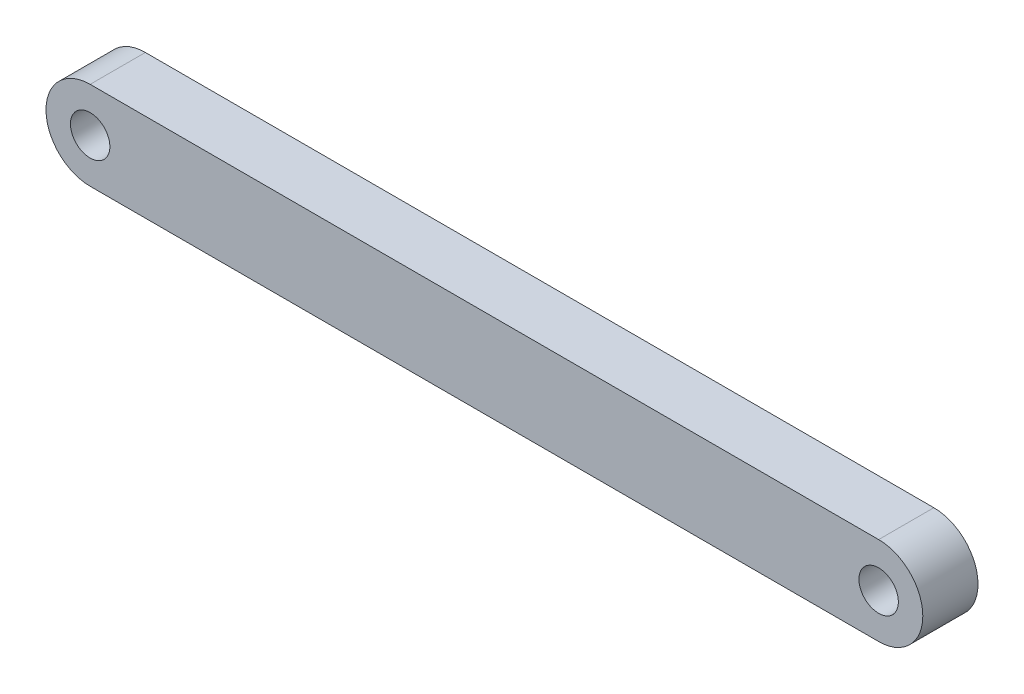
ISO-10303-21;
HEADER;
FILE_DESCRIPTION(('STEP AP214'),'2;1');
FILE_NAME('part.step','',(''),(''),'','','');
FILE_SCHEMA(('AUTOMOTIVE_DESIGN { 1 0 10303 214 1 1 1 1 }'));
ENDSEC;
DATA;
#1=APPLICATION_CONTEXT('core data for automotive mechanical design processes');
#2=APPLICATION_PROTOCOL_DEFINITION('international standard','automotive_design',2000,#1);
#3=PRODUCT_CONTEXT('',#1,'mechanical');
#4=PRODUCT('Part','Part','',(#3));
#5=PRODUCT_RELATED_PRODUCT_CATEGORY('part','',(#4));
#6=PRODUCT_DEFINITION_FORMATION('','',#4);
#7=PRODUCT_DEFINITION_CONTEXT('part definition',#1,'design');
#8=PRODUCT_DEFINITION('design','',#6,#7);
#9=PRODUCT_DEFINITION_SHAPE('','',#8);
#10=(LENGTH_UNIT() NAMED_UNIT(*) SI_UNIT(.MILLI.,.METRE.));
#11=(NAMED_UNIT(*) PLANE_ANGLE_UNIT() SI_UNIT($,.RADIAN.));
#12=(NAMED_UNIT(*) SI_UNIT($,.STERADIAN.) SOLID_ANGLE_UNIT());
#13=UNCERTAINTY_MEASURE_WITH_UNIT(LENGTH_MEASURE(1.E-05),#10,'distance_accuracy_value','');
#14=(GEOMETRIC_REPRESENTATION_CONTEXT(3) GLOBAL_UNCERTAINTY_ASSIGNED_CONTEXT((#13)) GLOBAL_UNIT_ASSIGNED_CONTEXT((#10,
#11,#12)) REPRESENTATION_CONTEXT('',''));
#15=CARTESIAN_POINT('',(0.,0.,0.));
#16=DIRECTION('',(0.,0.,1.));
#17=DIRECTION('',(1.,0.,0.));
#18=AXIS2_PLACEMENT_3D('',#15,#16,#17);
#19=CARTESIAN_POINT('',(454.527045833611,726.44,33.3375));
#20=DIRECTION('',(0.,0.,1.));
#21=DIRECTION('',(1.,0.,0.));
#22=AXIS2_PLACEMENT_3D('',#19,#20,#21);
#23=PLANE('',#22);
#24=CARTESIAN_POINT('',(454.527045833611,726.44,33.3375));
#25=DIRECTION('',(0.,0.,1.));
#26=DIRECTION('',(1.,0.,0.));
#27=AXIS2_PLACEMENT_3D('',#24,#25,#26);
#28=CIRCLE('',#27,7.9375);
#29=CARTESIAN_POINT('',(462.464545833611,726.44,33.3375));
#30=VERTEX_POINT('',#29);
#31=EDGE_CURVE('E100',#30,#30,#28,.T.);
#32=ORIENTED_EDGE('',*,*,#31,.F.);
#33=EDGE_LOOP('',(#32));
#34=FACE_BOUND('',#33,.T.);
#35=CARTESIAN_POINT('',(454.527045833611,726.44,33.3375));
#36=DIRECTION('',(0.,0.,1.));
#37=DIRECTION('',(1.,0.,0.));
#38=AXIS2_PLACEMENT_3D('',#35,#36,#37);
#39=CIRCLE('',#38,17.78);
#40=CARTESIAN_POINT('',(454.527045833611,744.22,33.3375));
#41=VERTEX_POINT('',#40);
#42=CARTESIAN_POINT('',(454.527045833611,708.66,33.3375));
#43=VERTEX_POINT('',#42);
#44=EDGE_CURVE('E85',#41,#43,#39,.T.);
#45=ORIENTED_EDGE('',*,*,#44,.T.);
#46=DIRECTION('',(1.,0.,0.));
#47=VECTOR('',#46,1.);
#48=CARTESIAN_POINT('',(454.527045833611,708.66,33.3375));
#49=LINE('',#48,#47);
#50=CARTESIAN_POINT('',(772.027045833611,708.66,33.3375));
#51=VERTEX_POINT('',#50);
#52=EDGE_CURVE('E80',#43,#51,#49,.T.);
#53=ORIENTED_EDGE('',*,*,#52,.T.);
#54=CARTESIAN_POINT('',(772.027045833611,726.44,33.3375));
#55=DIRECTION('',(0.,0.,1.));
#56=DIRECTION('',(-1.,0.,0.));
#57=AXIS2_PLACEMENT_3D('',#54,#55,#56);
#58=CIRCLE('',#57,17.78);
#59=CARTESIAN_POINT('',(772.027045833611,744.22,33.3375));
#60=VERTEX_POINT('',#59);
#61=EDGE_CURVE('E83',#51,#60,#58,.T.);
#62=ORIENTED_EDGE('',*,*,#61,.T.);
#63=DIRECTION('',(-1.,0.,0.));
#64=VECTOR('',#63,1.);
#65=CARTESIAN_POINT('',(454.527045833611,744.22,33.3375));
#66=LINE('',#65,#64);
#67=EDGE_CURVE('E50',#60,#41,#66,.T.);
#68=ORIENTED_EDGE('',*,*,#67,.T.);
#69=EDGE_LOOP('',(#45,#53,#62,#68));
#70=FACE_BOUND('',#69,.T.);
#71=CARTESIAN_POINT('',(772.027045833611,726.44,33.3375));
#72=DIRECTION('',(0.,0.,1.));
#73=DIRECTION('',(1.,0.,0.));
#74=AXIS2_PLACEMENT_3D('',#71,#72,#73);
#75=CIRCLE('',#74,7.9375000000001);
#76=CARTESIAN_POINT('',(779.964545833611,726.44,33.3375));
#77=VERTEX_POINT('',#76);
#78=EDGE_CURVE('E115',#77,#77,#75,.T.);
#79=ORIENTED_EDGE('',*,*,#78,.F.);
#80=EDGE_LOOP('',(#79));
#81=FACE_BOUND('',#80,.T.);
#82=ADVANCED_FACE('F33',(#34,#70,#81),#23,.T.);
#83=CARTESIAN_POINT('',(454.527045833611,726.44,11.1125));
#84=DIRECTION('',(0.,0.,1.));
#85=DIRECTION('',(1.,0.,0.));
#86=AXIS2_PLACEMENT_3D('',#83,#84,#85);
#87=PLANE('',#86);
#88=CARTESIAN_POINT('',(454.527045833611,726.44,11.1125));
#89=DIRECTION('',(0.,0.,1.));
#90=DIRECTION('',(1.,0.,0.));
#91=AXIS2_PLACEMENT_3D('',#88,#89,#90);
#92=CIRCLE('',#91,7.9375);
#93=CARTESIAN_POINT('',(462.464545833611,726.44,11.1125));
#94=VERTEX_POINT('',#93);
#95=EDGE_CURVE('E112',#94,#94,#92,.T.);
#96=ORIENTED_EDGE('',*,*,#95,.T.);
#97=EDGE_LOOP('',(#96));
#98=FACE_BOUND('',#97,.T.);
#99=CARTESIAN_POINT('',(454.527045833611,726.44,11.1125));
#100=DIRECTION('',(0.,0.,1.));
#101=DIRECTION('',(1.,0.,0.));
#102=AXIS2_PLACEMENT_3D('',#99,#100,#101);
#103=CIRCLE('',#102,17.78);
#104=CARTESIAN_POINT('',(454.527045833611,744.22,11.1125));
#105=VERTEX_POINT('',#104);
#106=CARTESIAN_POINT('',(454.527045833611,708.66,11.1125));
#107=VERTEX_POINT('',#106);
#108=EDGE_CURVE('E97',#105,#107,#103,.T.);
#109=ORIENTED_EDGE('',*,*,#108,.F.);
#110=DIRECTION('',(-1.,0.,0.));
#111=VECTOR('',#110,1.);
#112=CARTESIAN_POINT('',(454.527045833611,744.22,11.1125));
#113=LINE('',#112,#111);
#114=CARTESIAN_POINT('',(772.027045833611,744.22,11.1125));
#115=VERTEX_POINT('',#114);
#116=EDGE_CURVE('E73',#115,#105,#113,.T.);
#117=ORIENTED_EDGE('',*,*,#116,.F.);
#118=CARTESIAN_POINT('',(772.027045833611,726.44,11.1125));
#119=DIRECTION('',(0.,0.,1.));
#120=DIRECTION('',(-1.,0.,0.));
#121=AXIS2_PLACEMENT_3D('',#118,#119,#120);
#122=CIRCLE('',#121,17.78);
#123=CARTESIAN_POINT('',(772.027045833611,708.66,11.1125));
#124=VERTEX_POINT('',#123);
#125=EDGE_CURVE('E67',#124,#115,#122,.T.);
#126=ORIENTED_EDGE('',*,*,#125,.F.);
#127=DIRECTION('',(1.,0.,0.));
#128=VECTOR('',#127,1.);
#129=CARTESIAN_POINT('',(454.527045833611,708.66,11.1125));
#130=LINE('',#129,#128);
#131=EDGE_CURVE('E89',#107,#124,#130,.T.);
#132=ORIENTED_EDGE('',*,*,#131,.F.);
#133=EDGE_LOOP('',(#109,#117,#126,#132));
#134=FACE_BOUND('',#133,.T.);
#135=CARTESIAN_POINT('',(772.027045833611,726.44,11.1125));
#136=DIRECTION('',(0.,0.,1.));
#137=DIRECTION('',(1.,0.,0.));
#138=AXIS2_PLACEMENT_3D('',#135,#136,#137);
#139=CIRCLE('',#138,7.9375000000001);
#140=CARTESIAN_POINT('',(779.964545833611,726.44,11.1125));
#141=VERTEX_POINT('',#140);
#142=EDGE_CURVE('E118',#141,#141,#139,.T.);
#143=ORIENTED_EDGE('',*,*,#142,.T.);
#144=EDGE_LOOP('',(#143));
#145=FACE_BOUND('',#144,.T.);
#146=ADVANCED_FACE('F108',(#98,#134,#145),#87,.F.);
#147=CARTESIAN_POINT('',(454.527045833611,726.44,33.3375));
#148=DIRECTION('',(0.,0.,-1.));
#149=DIRECTION('',(-1.,0.,0.));
#150=AXIS2_PLACEMENT_3D('',#147,#148,#149);
#151=CYLINDRICAL_SURFACE('',#150,17.78);
#152=ORIENTED_EDGE('',*,*,#108,.T.);
#153=DIRECTION('',(0.,0.,-1.));
#154=VECTOR('',#153,1.);
#155=CARTESIAN_POINT('',(454.527045833611,708.66,33.3375));
#156=LINE('',#155,#154);
#157=EDGE_CURVE('E11',#43,#107,#156,.T.);
#158=ORIENTED_EDGE('',*,*,#157,.F.);
#159=ORIENTED_EDGE('',*,*,#44,.F.);
#160=DIRECTION('',(0.,0.,-1.));
#161=VECTOR('',#160,1.);
#162=CARTESIAN_POINT('',(454.527045833611,744.22,33.3375));
#163=LINE('',#162,#161);
#164=EDGE_CURVE('E93',#41,#105,#163,.T.);
#165=ORIENTED_EDGE('',*,*,#164,.T.);
#166=EDGE_LOOP('',(#152,#158,#159,#165));
#167=FACE_BOUND('',#166,.T.);
#168=ADVANCED_FACE('F35',(#167),#151,.T.);
#169=CARTESIAN_POINT('',(454.527045833611,708.66,33.3375));
#170=DIRECTION('',(0.,1.,0.));
#171=DIRECTION('',(0.,0.,1.));
#172=AXIS2_PLACEMENT_3D('',#169,#170,#171);
#173=PLANE('',#172);
#174=ORIENTED_EDGE('',*,*,#131,.T.);
#175=DIRECTION('',(0.,0.,-1.));
#176=VECTOR('',#175,1.);
#177=CARTESIAN_POINT('',(772.027045833611,708.66,33.3375));
#178=LINE('',#177,#176);
#179=EDGE_CURVE('E42',#51,#124,#178,.T.);
#180=ORIENTED_EDGE('',*,*,#179,.F.);
#181=ORIENTED_EDGE('',*,*,#52,.F.);
#182=ORIENTED_EDGE('',*,*,#157,.T.);
#183=EDGE_LOOP('',(#174,#180,#181,#182));
#184=FACE_BOUND('',#183,.T.);
#185=ADVANCED_FACE('F88',(#184),#173,.F.);
#186=CARTESIAN_POINT('',(772.027045833611,726.44,33.3375));
#187=DIRECTION('',(0.,0.,-1.));
#188=DIRECTION('',(-1.,0.,0.));
#189=AXIS2_PLACEMENT_3D('',#186,#187,#188);
#190=CYLINDRICAL_SURFACE('',#189,17.78);
#191=ORIENTED_EDGE('',*,*,#125,.T.);
#192=DIRECTION('',(0.,0.,-1.));
#193=VECTOR('',#192,1.);
#194=CARTESIAN_POINT('',(772.027045833611,744.22,33.3375));
#195=LINE('',#194,#193);
#196=EDGE_CURVE('E90',#60,#115,#195,.T.);
#197=ORIENTED_EDGE('',*,*,#196,.F.);
#198=ORIENTED_EDGE('',*,*,#61,.F.);
#199=ORIENTED_EDGE('',*,*,#179,.T.);
#200=EDGE_LOOP('',(#191,#197,#198,#199));
#201=FACE_BOUND('',#200,.T.);
#202=ADVANCED_FACE('F91',(#201),#190,.T.);
#203=CARTESIAN_POINT('',(454.527045833611,744.22,33.3375));
#204=DIRECTION('',(0.,-1.,0.));
#205=DIRECTION('',(0.,0.,-1.));
#206=AXIS2_PLACEMENT_3D('',#203,#204,#205);
#207=PLANE('',#206);
#208=ORIENTED_EDGE('',*,*,#116,.T.);
#209=ORIENTED_EDGE('',*,*,#164,.F.);
#210=ORIENTED_EDGE('',*,*,#67,.F.);
#211=ORIENTED_EDGE('',*,*,#196,.T.);
#212=EDGE_LOOP('',(#208,#209,#210,#211));
#213=FACE_BOUND('',#212,.T.);
#214=ADVANCED_FACE('F105',(#213),#207,.F.);
#215=CARTESIAN_POINT('',(454.527045833611,726.44,33.3375));
#216=DIRECTION('',(0.,0.,-1.));
#217=DIRECTION('',(-1.,0.,0.));
#218=AXIS2_PLACEMENT_3D('',#215,#216,#217);
#219=CYLINDRICAL_SURFACE('',#218,7.9375);
#220=ORIENTED_EDGE('',*,*,#31,.T.);
#221=EDGE_LOOP('',(#220));
#222=FACE_BOUND('',#221,.T.);
#223=ORIENTED_EDGE('',*,*,#95,.F.);
#224=EDGE_LOOP('',(#223));
#225=FACE_BOUND('',#224,.T.);
#226=ADVANCED_FACE('F136',(#222,#225),#219,.F.);
#227=CARTESIAN_POINT('',(772.027045833611,726.44,33.3375));
#228=DIRECTION('',(0.,0.,-1.));
#229=DIRECTION('',(-1.,0.,0.));
#230=AXIS2_PLACEMENT_3D('',#227,#228,#229);
#231=CYLINDRICAL_SURFACE('',#230,7.9375000000001);
#232=ORIENTED_EDGE('',*,*,#78,.T.);
#233=EDGE_LOOP('',(#232));
#234=FACE_BOUND('',#233,.T.);
#235=ORIENTED_EDGE('',*,*,#142,.F.);
#236=EDGE_LOOP('',(#235));
#237=FACE_BOUND('',#236,.T.);
#238=ADVANCED_FACE('F124',(#234,#237),#231,.F.);
#239=CLOSED_SHELL('',(#82,#146,#168,#185,#202,#214,#226,#238));
#240=MANIFOLD_SOLID_BREP('B2',#239);
#241=ADVANCED_BREP_SHAPE_REPRESENTATION('',(#18,#240),#14);
#242=SHAPE_DEFINITION_REPRESENTATION(#9,#241);
ENDSEC;
END-ISO-10303-21;
